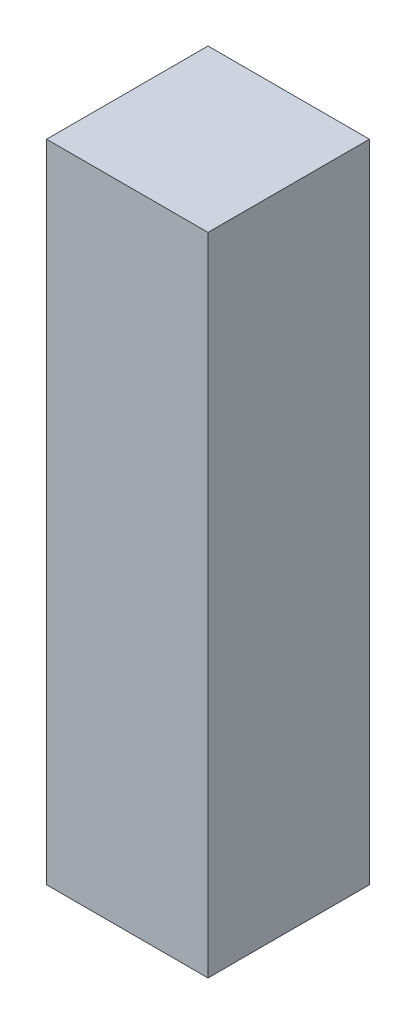
ISO-10303-21;
HEADER;
FILE_DESCRIPTION(('STEP AP214'),'2;1');
FILE_NAME('part.step','',(''),(''),'','','');
FILE_SCHEMA(('AUTOMOTIVE_DESIGN { 1 0 10303 214 1 1 1 1 }'));
ENDSEC;
DATA;
#1=APPLICATION_CONTEXT('core data for automotive mechanical design processes');
#2=APPLICATION_PROTOCOL_DEFINITION('international standard','automotive_design',2000,#1);
#3=PRODUCT_CONTEXT('',#1,'mechanical');
#4=PRODUCT('Part','Part','',(#3));
#5=PRODUCT_RELATED_PRODUCT_CATEGORY('part','',(#4));
#6=PRODUCT_DEFINITION_FORMATION('','',#4);
#7=PRODUCT_DEFINITION_CONTEXT('part definition',#1,'design');
#8=PRODUCT_DEFINITION('design','',#6,#7);
#9=PRODUCT_DEFINITION_SHAPE('','',#8);
#10=(LENGTH_UNIT() NAMED_UNIT(*) SI_UNIT(.MILLI.,.METRE.));
#11=(NAMED_UNIT(*) PLANE_ANGLE_UNIT() SI_UNIT($,.RADIAN.));
#12=(NAMED_UNIT(*) SI_UNIT($,.STERADIAN.) SOLID_ANGLE_UNIT());
#13=UNCERTAINTY_MEASURE_WITH_UNIT(LENGTH_MEASURE(1.E-05),#10,'distance_accuracy_value','');
#14=(GEOMETRIC_REPRESENTATION_CONTEXT(3) GLOBAL_UNCERTAINTY_ASSIGNED_CONTEXT((#13)) GLOBAL_UNIT_ASSIGNED_CONTEXT((#10,
#11,#12)) REPRESENTATION_CONTEXT('',''));
#15=CARTESIAN_POINT('',(0.,0.,0.));
#16=DIRECTION('',(0.,0.,1.));
#17=DIRECTION('',(1.,0.,0.));
#18=AXIS2_PLACEMENT_3D('',#15,#16,#17);
#19=CARTESIAN_POINT('',(6.47025835687209E-11,0.,0.));
#20=DIRECTION('',(1.29464147735625E-12,-1.,0.));
#21=DIRECTION('',(0.,0.,1.));
#22=AXIS2_PLACEMENT_3D('',#19,#20,#21);
#23=PLANE('',#22);
#24=DIRECTION('',(-1.,-1.29464147735625E-12,0.));
#25=VECTOR('',#24,1.);
#26=CARTESIAN_POINT('',(12.5000000000647,1.62647673107585E-11,-12.5));
#27=LINE('',#26,#25);
#28=CARTESIAN_POINT('',(12.5000000000647,1.62647673107585E-11,-12.5));
#29=VERTEX_POINT('',#28);
#30=CARTESIAN_POINT('',(-12.4999999999353,-1.60982338570648E-11,-12.5));
#31=VERTEX_POINT('',#30);
#32=EDGE_CURVE('E169',#29,#31,#27,.T.);
#33=ORIENTED_EDGE('',*,*,#32,.F.);
#34=DIRECTION('',(0.,0.,-1.));
#35=VECTOR('',#34,1.);
#36=CARTESIAN_POINT('',(12.5000000000647,1.62647673107585E-11,12.5));
#37=LINE('',#36,#35);
#38=CARTESIAN_POINT('',(12.5000000000647,1.62647673107585E-11,12.5));
#39=VERTEX_POINT('',#38);
#40=EDGE_CURVE('E178',#39,#29,#37,.T.);
#41=ORIENTED_EDGE('',*,*,#40,.F.);
#42=DIRECTION('',(-1.,-1.29464147735625E-12,0.));
#43=VECTOR('',#42,1.);
#44=CARTESIAN_POINT('',(12.5000000000647,1.62647673107585E-11,12.5));
#45=LINE('',#44,#43);
#46=CARTESIAN_POINT('',(-12.4999999999353,-1.60982338570648E-11,12.5));
#47=VERTEX_POINT('',#46);
#48=EDGE_CURVE('E175',#39,#47,#45,.T.);
#49=ORIENTED_EDGE('',*,*,#48,.T.);
#50=DIRECTION('',(0.,0.,-1.));
#51=VECTOR('',#50,1.);
#52=CARTESIAN_POINT('',(-12.4999999999353,-1.60982338570648E-11,12.5));
#53=LINE('',#52,#51);
#54=EDGE_CURVE('E95',#47,#31,#53,.T.);
#55=ORIENTED_EDGE('',*,*,#54,.T.);
#56=EDGE_LOOP('',(#33,#41,#49,#55));
#57=FACE_BOUND('',#56,.T.);
#58=DIRECTION('',(0.,0.,-1.));
#59=VECTOR('',#58,1.);
#60=CARTESIAN_POINT('',(9.5000000000647,1.23789867245705E-11,12.5));
#61=LINE('',#60,#59);
#62=CARTESIAN_POINT('',(9.5000000000647,1.23789867245705E-11,9.5));
#63=VERTEX_POINT('',#62);
#64=CARTESIAN_POINT('',(9.5000000000647,1.23789867245705E-11,-9.5));
#65=VERTEX_POINT('',#64);
#66=EDGE_CURVE('E161',#63,#65,#61,.T.);
#67=ORIENTED_EDGE('',*,*,#66,.T.);
#68=DIRECTION('',(-1.,-1.29464147735625E-12,0.));
#69=VECTOR('',#68,1.);
#70=CARTESIAN_POINT('',(12.5000000000647,1.62647673107585E-11,-9.5));
#71=LINE('',#70,#69);
#72=CARTESIAN_POINT('',(-9.4999999999353,-1.22124532708767E-11,-9.5));
#73=VERTEX_POINT('',#72);
#74=EDGE_CURVE('E125',#65,#73,#71,.T.);
#75=ORIENTED_EDGE('',*,*,#74,.T.);
#76=DIRECTION('',(0.,0.,-1.));
#77=VECTOR('',#76,1.);
#78=CARTESIAN_POINT('',(-9.4999999999353,-1.22124532708767E-11,12.5));
#79=LINE('',#78,#77);
#80=CARTESIAN_POINT('',(-9.4999999999353,-1.22124532708767E-11,9.5));
#81=VERTEX_POINT('',#80);
#82=EDGE_CURVE('E149',#81,#73,#79,.T.);
#83=ORIENTED_EDGE('',*,*,#82,.F.);
#84=DIRECTION('',(-1.,-1.29464147735625E-12,0.));
#85=VECTOR('',#84,1.);
#86=CARTESIAN_POINT('',(12.5000000000647,1.62647673107585E-11,9.5));
#87=LINE('',#86,#85);
#88=EDGE_CURVE('E164',#63,#81,#87,.T.);
#89=ORIENTED_EDGE('',*,*,#88,.F.);
#90=EDGE_LOOP('',(#67,#75,#83,#89));
#91=FACE_BOUND('',#90,.T.);
#92=ADVANCED_FACE('F44',(#57,#91),#23,.T.);
#93=CARTESIAN_POINT('',(12.5000000000647,1.62647673107585E-11,-12.5));
#94=DIRECTION('',(0.,0.,-1.));
#95=DIRECTION('',(1.,1.29464147735625E-12,0.));
#96=AXIS2_PLACEMENT_3D('',#93,#94,#95);
#97=PLANE('',#96);
#98=DIRECTION('',(-1.,-1.29464147735625E-12,0.));
#99=VECTOR('',#98,1.);
#100=CARTESIAN_POINT('',(12.4999999999352,100.000000000016,-12.5));
#101=LINE('',#100,#99);
#102=CARTESIAN_POINT('',(12.4999999999352,100.000000000016,-12.5));
#103=VERTEX_POINT('',#102);
#104=CARTESIAN_POINT('',(-12.5000000000648,99.9999999999839,-12.5));
#105=VERTEX_POINT('',#104);
#106=EDGE_CURVE('E131',#103,#105,#101,.T.);
#107=ORIENTED_EDGE('',*,*,#106,.F.);
#108=DIRECTION('',(-1.29464147735625E-12,1.,0.));
#109=VECTOR('',#108,1.);
#110=CARTESIAN_POINT('',(12.5000000000647,1.62647673107585E-11,-12.5));
#111=LINE('',#110,#109);
#112=EDGE_CURVE('E11',#29,#103,#111,.T.);
#113=ORIENTED_EDGE('',*,*,#112,.F.);
#114=ORIENTED_EDGE('',*,*,#32,.T.);
#115=DIRECTION('',(-1.29464147735625E-12,1.,0.));
#116=VECTOR('',#115,1.);
#117=CARTESIAN_POINT('',(-12.4999999999353,-1.60982338570648E-11,-12.5));
#118=LINE('',#117,#116);
#119=EDGE_CURVE('E48',#31,#105,#118,.T.);
#120=ORIENTED_EDGE('',*,*,#119,.T.);
#121=EDGE_LOOP('',(#107,#113,#114,#120));
#122=FACE_BOUND('',#121,.T.);
#123=ADVANCED_FACE('F46',(#122),#97,.T.);
#124=CARTESIAN_POINT('',(12.5000000000647,1.62647673107585E-11,12.5));
#125=DIRECTION('',(1.,1.29464147735625E-12,0.));
#126=DIRECTION('',(0.,0.,1.));
#127=AXIS2_PLACEMENT_3D('',#124,#125,#126);
#128=PLANE('',#127);
#129=DIRECTION('',(0.,0.,-1.));
#130=VECTOR('',#129,1.);
#131=CARTESIAN_POINT('',(12.4999999999352,100.000000000016,12.5));
#132=LINE('',#131,#130);
#133=CARTESIAN_POINT('',(12.4999999999352,100.000000000016,12.5));
#134=VERTEX_POINT('',#133);
#135=EDGE_CURVE('E172',#134,#103,#132,.T.);
#136=ORIENTED_EDGE('',*,*,#135,.F.);
#137=DIRECTION('',(-1.29464147735625E-12,1.,0.));
#138=VECTOR('',#137,1.);
#139=CARTESIAN_POINT('',(12.5000000000647,1.62647673107585E-11,12.5));
#140=LINE('',#139,#138);
#141=EDGE_CURVE('E54',#39,#134,#140,.T.);
#142=ORIENTED_EDGE('',*,*,#141,.F.);
#143=ORIENTED_EDGE('',*,*,#40,.T.);
#144=ORIENTED_EDGE('',*,*,#112,.T.);
#145=EDGE_LOOP('',(#136,#142,#143,#144));
#146=FACE_BOUND('',#145,.T.);
#147=ADVANCED_FACE('F206',(#146),#128,.T.);
#148=CARTESIAN_POINT('',(12.5000000000647,1.62647673107585E-11,12.5));
#149=DIRECTION('',(0.,0.,-1.));
#150=DIRECTION('',(1.,1.29464147735625E-12,0.));
#151=AXIS2_PLACEMENT_3D('',#148,#149,#150);
#152=PLANE('',#151);
#153=DIRECTION('',(-1.,-1.29464147735625E-12,0.));
#154=VECTOR('',#153,1.);
#155=CARTESIAN_POINT('',(12.4999999999352,100.000000000016,12.5));
#156=LINE('',#155,#154);
#157=CARTESIAN_POINT('',(-12.5000000000648,99.9999999999839,12.5));
#158=VERTEX_POINT('',#157);
#159=EDGE_CURVE('E188',#134,#158,#156,.T.);
#160=ORIENTED_EDGE('',*,*,#159,.T.);
#161=DIRECTION('',(-1.29464147735625E-12,1.,0.));
#162=VECTOR('',#161,1.);
#163=CARTESIAN_POINT('',(-12.4999999999353,-1.60982338570648E-11,12.5));
#164=LINE('',#163,#162);
#165=EDGE_CURVE('E195',#47,#158,#164,.T.);
#166=ORIENTED_EDGE('',*,*,#165,.F.);
#167=ORIENTED_EDGE('',*,*,#48,.F.);
#168=ORIENTED_EDGE('',*,*,#141,.T.);
#169=EDGE_LOOP('',(#160,#166,#167,#168));
#170=FACE_BOUND('',#169,.T.);
#171=ADVANCED_FACE('F210',(#170),#152,.F.);
#172=CARTESIAN_POINT('',(-12.4999999999353,-1.60982338570648E-11,12.5));
#173=DIRECTION('',(1.,1.29464147735625E-12,0.));
#174=DIRECTION('',(0.,0.,1.));
#175=AXIS2_PLACEMENT_3D('',#172,#173,#174);
#176=PLANE('',#175);
#177=DIRECTION('',(0.,0.,-1.));
#178=VECTOR('',#177,1.);
#179=CARTESIAN_POINT('',(-12.5000000000648,99.9999999999839,12.5));
#180=LINE('',#179,#178);
#181=EDGE_CURVE('E184',#158,#105,#180,.T.);
#182=ORIENTED_EDGE('',*,*,#181,.T.);
#183=ORIENTED_EDGE('',*,*,#119,.F.);
#184=ORIENTED_EDGE('',*,*,#54,.F.);
#185=ORIENTED_EDGE('',*,*,#165,.T.);
#186=EDGE_LOOP('',(#182,#183,#184,#185));
#187=FACE_BOUND('',#186,.T.);
#188=ADVANCED_FACE('F202',(#187),#176,.F.);
#189=CARTESIAN_POINT('',(-6.47615641669042E-11,100.,0.));
#190=DIRECTION('',(1.29464147735625E-12,-1.,0.));
#191=DIRECTION('',(0.,0.,1.));
#192=AXIS2_PLACEMENT_3D('',#189,#190,#191);
#193=PLANE('',#192);
#194=ORIENTED_EDGE('',*,*,#106,.T.);
#195=ORIENTED_EDGE('',*,*,#181,.F.);
#196=ORIENTED_EDGE('',*,*,#159,.F.);
#197=ORIENTED_EDGE('',*,*,#135,.T.);
#198=EDGE_LOOP('',(#194,#195,#196,#197));
#199=FACE_BOUND('',#198,.T.);
#200=ADVANCED_FACE('F205',(#199),#193,.F.);
#201=CARTESIAN_POINT('',(12.5000000000647,1.62647673107585E-11,-9.5));
#202=DIRECTION('',(0.,0.,-1.));
#203=DIRECTION('',(1.,1.29464147735625E-12,0.));
#204=AXIS2_PLACEMENT_3D('',#201,#202,#203);
#205=PLANE('',#204);
#206=DIRECTION('',(-1.,-1.29464147735625E-12,0.));
#207=VECTOR('',#206,1.);
#208=CARTESIAN_POINT('',(12.4999999999391,97.0000000000163,-9.5));
#209=LINE('',#208,#207);
#210=CARTESIAN_POINT('',(9.49999999993912,97.0000000000124,-9.5));
#211=VERTEX_POINT('',#210);
#212=CARTESIAN_POINT('',(-9.50000000006088,96.9999999999878,-9.5));
#213=VERTEX_POINT('',#212);
#214=EDGE_CURVE('E123',#211,#213,#209,.T.);
#215=ORIENTED_EDGE('',*,*,#214,.T.);
#216=DIRECTION('',(-1.29464147735625E-12,1.,0.));
#217=VECTOR('',#216,1.);
#218=CARTESIAN_POINT('',(-9.4999999999353,-1.22124532708767E-11,-9.5));
#219=LINE('',#218,#217);
#220=EDGE_CURVE('E154',#73,#213,#219,.T.);
#221=ORIENTED_EDGE('',*,*,#220,.F.);
#222=ORIENTED_EDGE('',*,*,#74,.F.);
#223=DIRECTION('',(-1.29464147735625E-12,1.,0.));
#224=VECTOR('',#223,1.);
#225=CARTESIAN_POINT('',(9.5000000000647,1.23789867245705E-11,-9.5));
#226=LINE('',#225,#224);
#227=EDGE_CURVE('E119',#65,#211,#226,.T.);
#228=ORIENTED_EDGE('',*,*,#227,.T.);
#229=EDGE_LOOP('',(#215,#221,#222,#228));
#230=FACE_BOUND('',#229,.T.);
#231=ADVANCED_FACE('F121',(#230),#205,.F.);
#232=CARTESIAN_POINT('',(9.5000000000647,1.23789867245705E-11,12.5));
#233=DIRECTION('',(1.,1.29464147735625E-12,0.));
#234=DIRECTION('',(0.,0.,1.));
#235=AXIS2_PLACEMENT_3D('',#232,#233,#234);
#236=PLANE('',#235);
#237=DIRECTION('',(0.,0.,-1.));
#238=VECTOR('',#237,1.);
#239=CARTESIAN_POINT('',(9.49999999993912,97.0000000000124,12.5));
#240=LINE('',#239,#238);
#241=CARTESIAN_POINT('',(9.49999999993912,97.0000000000124,9.5));
#242=VERTEX_POINT('',#241);
#243=EDGE_CURVE('E138',#242,#211,#240,.T.);
#244=ORIENTED_EDGE('',*,*,#243,.T.);
#245=ORIENTED_EDGE('',*,*,#227,.F.);
#246=ORIENTED_EDGE('',*,*,#66,.F.);
#247=DIRECTION('',(-1.29464147735625E-12,1.,0.));
#248=VECTOR('',#247,1.);
#249=CARTESIAN_POINT('',(9.5000000000647,1.23789867245705E-11,9.5));
#250=LINE('',#249,#248);
#251=EDGE_CURVE('E132',#63,#242,#250,.T.);
#252=ORIENTED_EDGE('',*,*,#251,.T.);
#253=EDGE_LOOP('',(#244,#245,#246,#252));
#254=FACE_BOUND('',#253,.T.);
#255=ADVANCED_FACE('F142',(#254),#236,.F.);
#256=CARTESIAN_POINT('',(12.5000000000647,1.62647673107585E-11,9.5));
#257=DIRECTION('',(0.,0.,-1.));
#258=DIRECTION('',(1.,1.29464147735625E-12,0.));
#259=AXIS2_PLACEMENT_3D('',#256,#257,#258);
#260=PLANE('',#259);
#261=DIRECTION('',(-1.,-1.29464147735625E-12,0.));
#262=VECTOR('',#261,1.);
#263=CARTESIAN_POINT('',(12.4999999999391,97.0000000000163,9.5));
#264=LINE('',#263,#262);
#265=CARTESIAN_POINT('',(-9.50000000006088,96.9999999999878,9.5));
#266=VERTEX_POINT('',#265);
#267=EDGE_CURVE('E145',#242,#266,#264,.T.);
#268=ORIENTED_EDGE('',*,*,#267,.F.);
#269=ORIENTED_EDGE('',*,*,#251,.F.);
#270=ORIENTED_EDGE('',*,*,#88,.T.);
#271=DIRECTION('',(-1.29464147735625E-12,1.,0.));
#272=VECTOR('',#271,1.);
#273=CARTESIAN_POINT('',(-9.4999999999353,-1.22124532708767E-11,9.5));
#274=LINE('',#273,#272);
#275=EDGE_CURVE('E62',#81,#266,#274,.T.);
#276=ORIENTED_EDGE('',*,*,#275,.T.);
#277=EDGE_LOOP('',(#268,#269,#270,#276));
#278=FACE_BOUND('',#277,.T.);
#279=ADVANCED_FACE('F217',(#278),#260,.T.);
#280=CARTESIAN_POINT('',(-9.4999999999353,-1.22124532708767E-11,12.5));
#281=DIRECTION('',(1.,1.29464147735625E-12,0.));
#282=DIRECTION('',(0.,0.,1.));
#283=AXIS2_PLACEMENT_3D('',#280,#281,#282);
#284=PLANE('',#283);
#285=DIRECTION('',(0.,0.,-1.));
#286=VECTOR('',#285,1.);
#287=CARTESIAN_POINT('',(-9.50000000006088,96.9999999999878,12.5));
#288=LINE('',#287,#286);
#289=EDGE_CURVE('E139',#266,#213,#288,.T.);
#290=ORIENTED_EDGE('',*,*,#289,.F.);
#291=ORIENTED_EDGE('',*,*,#275,.F.);
#292=ORIENTED_EDGE('',*,*,#82,.T.);
#293=ORIENTED_EDGE('',*,*,#220,.T.);
#294=EDGE_LOOP('',(#290,#291,#292,#293));
#295=FACE_BOUND('',#294,.T.);
#296=ADVANCED_FACE('F218',(#295),#284,.T.);
#297=CARTESIAN_POINT('',(-6.08776397348354E-11,97.0000000000001,0.));
#298=DIRECTION('',(1.29464147735625E-12,-1.,0.));
#299=DIRECTION('',(0.,0.,1.));
#300=AXIS2_PLACEMENT_3D('',#297,#298,#299);
#301=PLANE('',#300);
#302=ORIENTED_EDGE('',*,*,#214,.F.);
#303=ORIENTED_EDGE('',*,*,#243,.F.);
#304=ORIENTED_EDGE('',*,*,#267,.T.);
#305=ORIENTED_EDGE('',*,*,#289,.T.);
#306=EDGE_LOOP('',(#302,#303,#304,#305));
#307=FACE_BOUND('',#306,.T.);
#308=ADVANCED_FACE('F137',(#307),#301,.T.);
#309=CLOSED_SHELL('',(#92,#123,#147,#171,#188,#200,#231,#255,#279,#296,#308));
#310=MANIFOLD_SOLID_BREP('B2',#309);
#311=ADVANCED_BREP_SHAPE_REPRESENTATION('',(#18,#310),#14);
#312=SHAPE_DEFINITION_REPRESENTATION(#9,#311);
ENDSEC;
END-ISO-10303-21;
